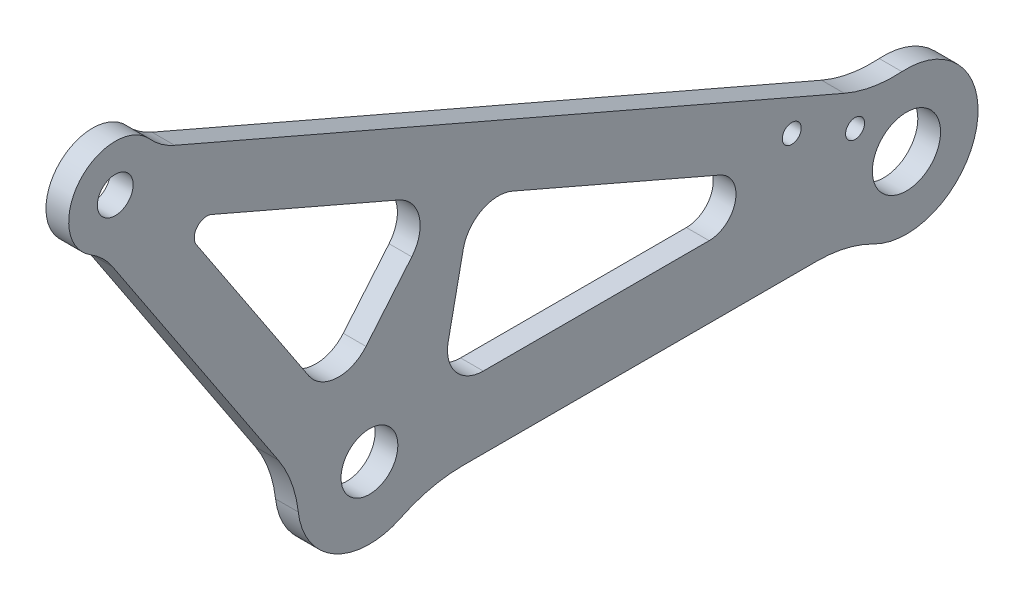
ISO-10303-21;
HEADER;
FILE_DESCRIPTION(('STEP AP214'),'2;1');
FILE_NAME('part.step','',(''),(''),'','','');
FILE_SCHEMA(('AUTOMOTIVE_DESIGN { 1 0 10303 214 1 1 1 1 }'));
ENDSEC;
DATA;
#1=APPLICATION_CONTEXT('core data for automotive mechanical design processes');
#2=APPLICATION_PROTOCOL_DEFINITION('international standard','automotive_design',2000,#1);
#3=PRODUCT_CONTEXT('',#1,'mechanical');
#4=PRODUCT('Part','Part','',(#3));
#5=PRODUCT_RELATED_PRODUCT_CATEGORY('part','',(#4));
#6=PRODUCT_DEFINITION_FORMATION('','',#4);
#7=PRODUCT_DEFINITION_CONTEXT('part definition',#1,'design');
#8=PRODUCT_DEFINITION('design','',#6,#7);
#9=PRODUCT_DEFINITION_SHAPE('','',#8);
#10=(LENGTH_UNIT() NAMED_UNIT(*) SI_UNIT(.MILLI.,.METRE.));
#11=(NAMED_UNIT(*) PLANE_ANGLE_UNIT() SI_UNIT($,.RADIAN.));
#12=(NAMED_UNIT(*) SI_UNIT($,.STERADIAN.) SOLID_ANGLE_UNIT());
#13=UNCERTAINTY_MEASURE_WITH_UNIT(LENGTH_MEASURE(1.E-05),#10,'distance_accuracy_value','');
#14=(GEOMETRIC_REPRESENTATION_CONTEXT(3) GLOBAL_UNCERTAINTY_ASSIGNED_CONTEXT((#13)) GLOBAL_UNIT_ASSIGNED_CONTEXT((#10,
#11,#12)) REPRESENTATION_CONTEXT('',''));
#15=CARTESIAN_POINT('',(0.,0.,0.));
#16=DIRECTION('',(0.,0.,1.));
#17=DIRECTION('',(1.,0.,0.));
#18=AXIS2_PLACEMENT_3D('',#15,#16,#17);
#19=CARTESIAN_POINT('',(6.35,14.,75.));
#20=DIRECTION('',(-1.,0.,0.));
#21=DIRECTION('',(0.,0.,1.));
#22=AXIS2_PLACEMENT_3D('',#19,#20,#21);
#23=CYLINDRICAL_SURFACE('',#22,20.);
#24=CARTESIAN_POINT('',(0.,14.,75.));
#25=DIRECTION('',(1.,0.,0.));
#26=DIRECTION('',(0.,0.,-1.));
#27=AXIS2_PLACEMENT_3D('',#24,#25,#26);
#28=CIRCLE('',#27,20.);
#29=CARTESIAN_POINT('',(0.,11.7382225914099,94.8716975357917));
#30=VERTEX_POINT('',#29);
#31=CARTESIAN_POINT('',(0.,-3.99999999999999,66.2822021129186));
#32=VERTEX_POINT('',#31);
#33=EDGE_CURVE('E376',#30,#32,#28,.T.);
#34=ORIENTED_EDGE('',*,*,#33,.T.);
#35=DIRECTION('',(-1.,0.,0.));
#36=VECTOR('',#35,1.);
#37=CARTESIAN_POINT('',(6.35,-3.99999999999999,66.2822021129186));
#38=LINE('',#37,#36);
#39=CARTESIAN_POINT('',(6.35,-3.99999999999999,66.2822021129186));
#40=VERTEX_POINT('',#39);
#41=EDGE_CURVE('E75',#32,#40,#38,.F.);
#42=ORIENTED_EDGE('',*,*,#41,.T.);
#43=CARTESIAN_POINT('',(6.35,14.,75.));
#44=DIRECTION('',(1.,0.,0.));
#45=DIRECTION('',(0.,0.,-1.));
#46=AXIS2_PLACEMENT_3D('',#43,#44,#45);
#47=CIRCLE('',#46,20.);
#48=CARTESIAN_POINT('',(6.35,11.7382225914099,94.8716975357917));
#49=VERTEX_POINT('',#48);
#50=EDGE_CURVE('E377',#49,#40,#47,.T.);
#51=ORIENTED_EDGE('',*,*,#50,.F.);
#52=DIRECTION('',(-1.,0.,0.));
#53=VECTOR('',#52,1.);
#54=CARTESIAN_POINT('',(6.35,11.7382225914099,94.8716975357917));
#55=LINE('',#54,#53);
#56=EDGE_CURVE('E399',#49,#30,#55,.T.);
#57=ORIENTED_EDGE('',*,*,#56,.T.);
#58=EDGE_LOOP('',(#34,#42,#51,#57));
#59=FACE_BOUND('',#58,.T.);
#60=ADVANCED_FACE('F51',(#59),#23,.T.);
#61=CARTESIAN_POINT('',(6.35,0.,60.7171431429143));
#62=DIRECTION('',(0.,1.,0.));
#63=DIRECTION('',(0.,0.,1.));
#64=AXIS2_PLACEMENT_3D('',#61,#62,#63);
#65=PLANE('',#64);
#66=DIRECTION('',(0.,0.,-1.));
#67=VECTOR('',#66,1.);
#68=CARTESIAN_POINT('',(6.35,0.,60.7171431429143));
#69=LINE('',#68,#67);
#70=CARTESIAN_POINT('',(6.35,0.,48.8466063387559));
#71=VERTEX_POINT('',#70);
#72=CARTESIAN_POINT('',(6.35,0.,-50.0200080064063));
#73=VERTEX_POINT('',#72);
#74=EDGE_CURVE('E380',#71,#73,#69,.T.);
#75=ORIENTED_EDGE('',*,*,#74,.F.);
#76=DIRECTION('',(1.,0.,0.));
#77=VECTOR('',#76,1.);
#78=CARTESIAN_POINT('',(0.,0.,48.8466063387559));
#79=LINE('',#78,#77);
#80=CARTESIAN_POINT('',(0.,0.,48.8466063387559));
#81=VERTEX_POINT('',#80);
#82=EDGE_CURVE('E487',#71,#81,#79,.F.);
#83=ORIENTED_EDGE('',*,*,#82,.T.);
#84=DIRECTION('',(0.,0.,-1.));
#85=VECTOR('',#84,1.);
#86=CARTESIAN_POINT('',(0.,0.,60.7171431429143));
#87=LINE('',#86,#85);
#88=CARTESIAN_POINT('',(0.,0.,-50.0200080064063));
#89=VERTEX_POINT('',#88);
#90=EDGE_CURVE('E402',#81,#89,#87,.T.);
#91=ORIENTED_EDGE('',*,*,#90,.T.);
#92=DIRECTION('',(1.,0.,0.));
#93=VECTOR('',#92,1.);
#94=CARTESIAN_POINT('',(6.35,0.,-50.0200080064063));
#95=LINE('',#94,#93);
#96=EDGE_CURVE('E444',#89,#73,#95,.T.);
#97=ORIENTED_EDGE('',*,*,#96,.T.);
#98=EDGE_LOOP('',(#75,#83,#91,#97));
#99=FACE_BOUND('',#98,.T.);
#100=ADVANCED_FACE('F539',(#99),#65,.F.);
#101=CARTESIAN_POINT('',(6.35,14.,-75.));
#102=DIRECTION('',(-1.,0.,0.));
#103=DIRECTION('',(0.,0.,1.));
#104=AXIS2_PLACEMENT_3D('',#101,#102,#103);
#105=CYLINDRICAL_SURFACE('',#104,20.);
#106=CARTESIAN_POINT('',(0.,14.,-75.));
#107=DIRECTION('',(1.,0.,0.));
#108=DIRECTION('',(0.,0.,-1.));
#109=AXIS2_PLACEMENT_3D('',#106,#107,#108);
#110=CIRCLE('',#109,20.);
#111=CARTESIAN_POINT('',(0.,-3.81818181818182,-65.9163665477841));
#112=VERTEX_POINT('',#111);
#113=CARTESIAN_POINT('',(0.,33.9602946671476,-73.7403822799596));
#114=VERTEX_POINT('',#113);
#115=EDGE_CURVE('E405',#112,#114,#110,.T.);
#116=ORIENTED_EDGE('',*,*,#115,.T.);
#117=DIRECTION('',(-1.,0.,0.));
#118=VECTOR('',#117,1.);
#119=CARTESIAN_POINT('',(6.35,33.9602946671476,-73.7403822799596));
#120=LINE('',#119,#118);
#121=CARTESIAN_POINT('',(6.35,33.9602946671476,-73.7403822799596));
#122=VERTEX_POINT('',#121);
#123=EDGE_CURVE('E441',#114,#122,#120,.F.);
#124=ORIENTED_EDGE('',*,*,#123,.T.);
#125=CARTESIAN_POINT('',(6.35,14.,-75.));
#126=DIRECTION('',(1.,0.,0.));
#127=DIRECTION('',(0.,0.,-1.));
#128=AXIS2_PLACEMENT_3D('',#125,#126,#127);
#129=CIRCLE('',#128,20.);
#130=CARTESIAN_POINT('',(6.35,-3.81818181818182,-65.9163665477841));
#131=VERTEX_POINT('',#130);
#132=EDGE_CURVE('E384',#131,#122,#129,.T.);
#133=ORIENTED_EDGE('',*,*,#132,.F.);
#134=DIRECTION('',(-1.,0.,0.));
#135=VECTOR('',#134,1.);
#136=CARTESIAN_POINT('',(6.35,-3.81818181818182,-65.9163665477841));
#137=LINE('',#136,#135);
#138=EDGE_CURVE('E437',#131,#112,#137,.T.);
#139=ORIENTED_EDGE('',*,*,#138,.T.);
#140=EDGE_LOOP('',(#116,#124,#133,#139));
#141=FACE_BOUND('',#140,.T.);
#142=ADVANCED_FACE('F545',(#141),#105,.T.);
#143=CARTESIAN_POINT('',(6.35,119.878311848488,134.404938559373));
#144=DIRECTION('',(0.,-0.917745162956209,0.39716975699376));
#145=DIRECTION('',(0.,-0.39716975699376,-0.917745162956209));
#146=AXIS2_PLACEMENT_3D('',#143,#144,#145);
#147=PLANE('',#146);
#148=DIRECTION('',(0.,0.39716975699376,0.917745162956209));
#149=VECTOR('',#148,1.);
#150=CARTESIAN_POINT('',(0.,119.878311848488,134.404938559373));
#151=LINE('',#150,#149);
#152=CARTESIAN_POINT('',(0.,36.7697296311885,-57.6351097751074));
#153=VERTEX_POINT('',#152);
#154=CARTESIAN_POINT('',(0.,117.717270204049,129.411392396283));
#155=VERTEX_POINT('',#154);
#156=EDGE_CURVE('E409',#153,#155,#151,.T.);
#157=ORIENTED_EDGE('',*,*,#156,.T.);
#158=DIRECTION('',(1.,0.,0.));
#159=VECTOR('',#158,1.);
#160=CARTESIAN_POINT('',(6.35,117.717270204049,129.411392396283));
#161=LINE('',#160,#159);
#162=CARTESIAN_POINT('',(6.35,117.717270204049,129.411392396283));
#163=VERTEX_POINT('',#162);
#164=EDGE_CURVE('E472',#155,#163,#161,.T.);
#165=ORIENTED_EDGE('',*,*,#164,.T.);
#166=DIRECTION('',(0.,0.39716975699376,0.917745162956209));
#167=VECTOR('',#166,1.);
#168=CARTESIAN_POINT('',(6.35,119.878311848488,134.404938559373));
#169=LINE('',#168,#167);
#170=CARTESIAN_POINT('',(6.35,36.7697296311885,-57.6351097751074));
#171=VERTEX_POINT('',#170);
#172=EDGE_CURVE('E388',#171,#163,#169,.T.);
#173=ORIENTED_EDGE('',*,*,#172,.F.);
#174=DIRECTION('',(1.,0.,0.));
#175=VECTOR('',#174,1.);
#176=CARTESIAN_POINT('',(0.,36.7697296311885,-57.6351097751074));
#177=LINE('',#176,#175);
#178=EDGE_CURVE('E433',#171,#153,#177,.F.);
#179=ORIENTED_EDGE('',*,*,#178,.T.);
#180=EDGE_LOOP('',(#157,#165,#173,#179));
#181=FACE_BOUND('',#180,.T.);
#182=ADVANCED_FACE('F594',(#181),#147,.F.);
#183=CARTESIAN_POINT('',(6.35,114.,146.));
#184=DIRECTION('',(-1.,0.,0.));
#185=DIRECTION('',(0.,0.,1.));
#186=AXIS2_PLACEMENT_3D('',#183,#184,#185);
#187=CYLINDRICAL_SURFACE('',#186,13.);
#188=CARTESIAN_POINT('',(0.,114.,146.));
#189=DIRECTION('',(1.,0.,0.));
#190=DIRECTION('',(0.,0.,-1.));
#191=AXIS2_PLACEMENT_3D('',#188,#189,#190);
#192=CIRCLE('',#191,13.);
#193=CARTESIAN_POINT('',(0.,122.695098637007,136.33587770707));
#194=VERTEX_POINT('',#193);
#195=CARTESIAN_POINT('',(0.,102.960290459899,152.864751508263));
#196=VERTEX_POINT('',#195);
#197=EDGE_CURVE('E413',#194,#196,#192,.T.);
#198=ORIENTED_EDGE('',*,*,#197,.T.);
#199=DIRECTION('',(-1.,0.,0.));
#200=VECTOR('',#199,1.);
#201=CARTESIAN_POINT('',(6.35,102.960290459899,152.864751508263));
#202=LINE('',#201,#200);
#203=CARTESIAN_POINT('',(6.35,102.960290459899,152.864751508263));
#204=VERTEX_POINT('',#203);
#205=EDGE_CURVE('E469',#196,#204,#202,.F.);
#206=ORIENTED_EDGE('',*,*,#205,.T.);
#207=CARTESIAN_POINT('',(6.35,114.,146.));
#208=DIRECTION('',(1.,0.,0.));
#209=DIRECTION('',(0.,0.,-1.));
#210=AXIS2_PLACEMENT_3D('',#207,#208,#209);
#211=CIRCLE('',#210,13.);
#212=CARTESIAN_POINT('',(6.35,122.695098637007,136.33587770707));
#213=VERTEX_POINT('',#212);
#214=EDGE_CURVE('E392',#213,#204,#211,.T.);
#215=ORIENTED_EDGE('',*,*,#214,.F.);
#216=DIRECTION('',(-1.,0.,0.));
#217=VECTOR('',#216,1.);
#218=CARTESIAN_POINT('',(6.35,122.695098637007,136.33587770707));
#219=LINE('',#218,#217);
#220=EDGE_CURVE('E465',#213,#194,#219,.T.);
#221=ORIENTED_EDGE('',*,*,#220,.T.);
#222=EDGE_LOOP('',(#198,#206,#215,#221));
#223=FACE_BOUND('',#222,.T.);
#224=ADVANCED_FACE('F580',(#223),#187,.T.);
#225=CARTESIAN_POINT('',(6.35,101.553480850632,149.752887030597));
#226=DIRECTION('',(0.,0.552019943967369,-0.833830906996294));
#227=DIRECTION('',(0.,0.833830906996294,0.552019943967369));
#228=AXIS2_PLACEMENT_3D('',#225,#226,#227);
#229=PLANE('',#228);
#230=DIRECTION('',(0.,-0.833830906996294,-0.552019943967369));
#231=VECTOR('',#230,1.);
#232=CARTESIAN_POINT('',(6.35,101.553480850632,149.752887030597));
#233=LINE('',#232,#231);
#234=CARTESIAN_POINT('',(6.35,97.0165208160136,146.749289534896));
#235=VERTEX_POINT('',#234);
#236=CARTESIAN_POINT('',(6.35,27.1008101652352,100.463086478557));
#237=VERTEX_POINT('',#236);
#238=EDGE_CURVE('E396',#235,#237,#233,.T.);
#239=ORIENTED_EDGE('',*,*,#238,.F.);
#240=DIRECTION('',(1.,0.,0.));
#241=VECTOR('',#240,1.);
#242=CARTESIAN_POINT('',(0.,97.0165208160136,146.749289534896));
#243=LINE('',#242,#241);
#244=CARTESIAN_POINT('',(0.,97.0165208160136,146.749289534896));
#245=VERTEX_POINT('',#244);
#246=EDGE_CURVE('E461',#235,#245,#243,.F.);
#247=ORIENTED_EDGE('',*,*,#246,.T.);
#248=DIRECTION('',(0.,-0.833830906996294,-0.552019943967369));
#249=VECTOR('',#248,1.);
#250=CARTESIAN_POINT('',(0.,101.553480850632,149.752887030597));
#251=LINE('',#250,#249);
#252=CARTESIAN_POINT('',(0.,27.1008101652352,100.463086478557));
#253=VERTEX_POINT('',#252);
#254=EDGE_CURVE('E381',#245,#253,#251,.T.);
#255=ORIENTED_EDGE('',*,*,#254,.T.);
#256=DIRECTION('',(1.,0.,0.));
#257=VECTOR('',#256,1.);
#258=CARTESIAN_POINT('',(6.35,27.1008101652352,100.463086478557));
#259=LINE('',#258,#257);
#260=EDGE_CURVE('E422',#253,#237,#259,.T.);
#261=ORIENTED_EDGE('',*,*,#260,.T.);
#262=EDGE_LOOP('',(#239,#247,#255,#261));
#263=FACE_BOUND('',#262,.T.);
#264=ADVANCED_FACE('F586',(#263),#229,.F.);
#265=CARTESIAN_POINT('',(6.35,14.,75.));
#266=DIRECTION('',(1.,0.,0.));
#267=DIRECTION('',(0.,0.,-1.));
#268=AXIS2_PLACEMENT_3D('',#265,#266,#267);
#269=PLANE('',#268);
#270=CARTESIAN_POINT('',(6.35,34.4007902462945,-42.9665272972412));
#271=DIRECTION('',(1.,0.,0.));
#272=DIRECTION('',(0.,0.,-1.));
#273=AXIS2_PLACEMENT_3D('',#270,#271,#272);
#274=CIRCLE('',#273,2.65);
#275=CARTESIAN_POINT('',(6.35,34.4007902462945,-45.6165272972412));
#276=VERTEX_POINT('',#275);
#277=EDGE_CURVE('E503',#276,#276,#274,.T.);
#278=ORIENTED_EDGE('',*,*,#277,.F.);
#279=EDGE_LOOP('',(#278));
#280=FACE_BOUND('',#279,.T.);
#281=CARTESIAN_POINT('',(6.35,26.7502274746188,-60.6447791126444));
#282=DIRECTION('',(1.,0.,0.));
#283=DIRECTION('',(0.,0.,-1.));
#284=AXIS2_PLACEMENT_3D('',#281,#282,#283);
#285=CIRCLE('',#284,2.65000000000001);
#286=CARTESIAN_POINT('',(6.35,26.7502274746188,-63.2947791126444));
#287=VERTEX_POINT('',#286);
#288=EDGE_CURVE('E495',#287,#287,#285,.T.);
#289=ORIENTED_EDGE('',*,*,#288,.F.);
#290=EDGE_LOOP('',(#289));
#291=FACE_BOUND('',#290,.T.);
#292=CARTESIAN_POINT('',(6.35,30.,43.1954781826125));
#293=DIRECTION('',(1.,0.,0.));
#294=DIRECTION('',(0.,0.,-1.));
#295=AXIS2_PLACEMENT_3D('',#292,#293,#294);
#296=CIRCLE('',#295,10.);
#297=CARTESIAN_POINT('',(6.35,32.0279896085014,52.9876821300296));
#298=VERTEX_POINT('',#297);
#299=CARTESIAN_POINT('',(6.35,20.,43.1954781826125));
#300=VERTEX_POINT('',#299);
#301=EDGE_CURVE('E222',#298,#300,#296,.T.);
#302=ORIENTED_EDGE('',*,*,#301,.F.);
#303=DIRECTION('',(0.,-0.979220394741707,0.202798960850138));
#304=VECTOR('',#303,1.);
#305=CARTESIAN_POINT('',(6.35,32.0279896085014,52.9876821300296));
#306=LINE('',#305,#304);
#307=CARTESIAN_POINT('',(6.35,52.2877363487515,48.7918385711406));
#308=VERTEX_POINT('',#307);
#309=EDGE_CURVE('E228',#308,#298,#306,.T.);
#310=ORIENTED_EDGE('',*,*,#309,.F.);
#311=CARTESIAN_POINT('',(6.35,50.2597467402501,38.9996346237235));
#312=DIRECTION('',(1.,0.,0.));
#313=DIRECTION('',(0.,0.,1.));
#314=AXIS2_PLACEMENT_3D('',#311,#312,#313);
#315=CIRCLE('',#314,10.);
#316=CARTESIAN_POINT('',(6.35,59.4371983698122,35.0279370537859));
#317=VERTEX_POINT('',#316);
#318=EDGE_CURVE('E266',#317,#308,#315,.T.);
#319=ORIENTED_EDGE('',*,*,#318,.F.);
#320=DIRECTION('',(0.,0.39716975699376,0.917745162956209));
#321=VECTOR('',#320,1.);
#322=CARTESIAN_POINT('',(6.35,59.4371983698122,35.0279370537859));
#323=LINE('',#322,#321);
#324=CARTESIAN_POINT('',(6.35,34.3830887221716,-22.8649098621939));
#325=VERTEX_POINT('',#324);
#326=EDGE_CURVE('E262',#325,#317,#323,.T.);
#327=ORIENTED_EDGE('',*,*,#326,.F.);
#328=CARTESIAN_POINT('',(6.35,27.5000000000001,-19.8861366847402));
#329=DIRECTION('',(1.,0.,0.));
#330=DIRECTION('',(0.,0.,-1.));
#331=AXIS2_PLACEMENT_3D('',#328,#329,#330);
#332=CIRCLE('',#331,7.50000000000012);
#333=CARTESIAN_POINT('',(6.35,20.,-19.8861366847407));
#334=VERTEX_POINT('',#333);
#335=EDGE_CURVE('E258',#334,#325,#332,.T.);
#336=ORIENTED_EDGE('',*,*,#335,.F.);
#337=DIRECTION('',(0.,0.,-1.));
#338=VECTOR('',#337,1.);
#339=CARTESIAN_POINT('',(6.35,20.,-19.8861366847407));
#340=LINE('',#339,#338);
#341=EDGE_CURVE('E250',#300,#334,#340,.T.);
#342=ORIENTED_EDGE('',*,*,#341,.F.);
#343=EDGE_LOOP('',(#302,#310,#319,#327,#336,#342));
#344=FACE_BOUND('',#343,.T.);
#345=CARTESIAN_POINT('',(6.35,92.581437501733,120.427100877121));
#346=DIRECTION('',(1.,0.,0.));
#347=DIRECTION('',(0.,0.,-1.));
#348=AXIS2_PLACEMENT_3D('',#345,#346,#347);
#349=CIRCLE('',#348,3.49999999999999);
#350=CARTESIAN_POINT('',(6.35,95.7935455720797,119.037006727643));
#351=VERTEX_POINT('',#350);
#352=CARTESIAN_POINT('',(6.35,90.6493676978472,123.345509051608));
#353=VERTEX_POINT('',#352);
#354=EDGE_CURVE('E330',#351,#353,#349,.T.);
#355=ORIENTED_EDGE('',*,*,#354,.F.);
#356=DIRECTION('',(0.,0.397169756993759,0.917745162956209));
#357=VECTOR('',#356,1.);
#358=CARTESIAN_POINT('',(6.35,95.7935455720797,119.037006727643));
#359=LINE('',#358,#357);
#360=CARTESIAN_POINT('',(6.35,73.2135031032277,66.8610180219863));
#361=VERTEX_POINT('',#360);
#362=EDGE_CURVE('E296',#361,#351,#359,.T.);
#363=ORIENTED_EDGE('',*,*,#362,.F.);
#364=CARTESIAN_POINT('',(6.35,64.0360514736656,70.8327155919239));
#365=DIRECTION('',(1.,0.,0.));
#366=DIRECTION('',(0.,0.,-1.));
#367=AXIS2_PLACEMENT_3D('',#364,#365,#366);
#368=CIRCLE('',#367,10.);
#369=CARTESIAN_POINT('',(6.35,57.6151528400077,63.1664217848558));
#370=VERTEX_POINT('',#369);
#371=EDGE_CURVE('E314',#370,#361,#368,.T.);
#372=ORIENTED_EDGE('',*,*,#371,.F.);
#373=DIRECTION('',(0.,0.766629380706807,-0.642089863365789));
#374=VECTOR('',#373,1.);
#375=CARTESIAN_POINT('',(6.35,42.3434042301445,75.9572633897303));
#376=LINE('',#375,#374);
#377=CARTESIAN_POINT('',(6.35,42.3434042301445,75.9572633897303));
#378=VERTEX_POINT('',#377);
#379=EDGE_CURVE('E318',#378,#370,#376,.T.);
#380=ORIENTED_EDGE('',*,*,#379,.F.);
#381=CARTESIAN_POINT('',(6.35,48.7643028638024,83.6235571967984));
#382=DIRECTION('',(1.,0.,0.));
#383=DIRECTION('',(0.,0.,1.));
#384=AXIS2_PLACEMENT_3D('',#381,#382,#383);
#385=CIRCLE('',#384,10.);
#386=CARTESIAN_POINT('',(6.35,43.2441034241287,91.9618662667613));
#387=VERTEX_POINT('',#386);
#388=EDGE_CURVE('E322',#387,#378,#385,.T.);
#389=ORIENTED_EDGE('',*,*,#388,.F.);
#390=DIRECTION('',(0.,-0.833830906996294,-0.552019943967369));
#391=VECTOR('',#390,1.);
#392=CARTESIAN_POINT('',(6.35,90.6493676978472,123.345509051608));
#393=LINE('',#392,#391);
#394=EDGE_CURVE('E326',#353,#387,#393,.T.);
#395=ORIENTED_EDGE('',*,*,#394,.F.);
#396=EDGE_LOOP('',(#355,#363,#372,#380,#389,#395));
#397=FACE_BOUND('',#396,.T.);
#398=CARTESIAN_POINT('',(6.35,14.,75.));
#399=DIRECTION('',(1.,0.,0.));
#400=DIRECTION('',(0.,0.,-1.));
#401=AXIS2_PLACEMENT_3D('',#398,#399,#400);
#402=CIRCLE('',#401,7.9375);
#403=CARTESIAN_POINT('',(6.35,14.,67.0625));
#404=VERTEX_POINT('',#403);
#405=EDGE_CURVE('E237',#404,#404,#402,.T.);
#406=ORIENTED_EDGE('',*,*,#405,.F.);
#407=EDGE_LOOP('',(#406));
#408=FACE_BOUND('',#407,.T.);
#409=CARTESIAN_POINT('',(6.35,114.,146.));
#410=DIRECTION('',(1.,0.,0.));
#411=DIRECTION('',(0.,0.,-1.));
#412=AXIS2_PLACEMENT_3D('',#409,#410,#411);
#413=CIRCLE('',#412,5.);
#414=CARTESIAN_POINT('',(6.35,114.,141.));
#415=VERTEX_POINT('',#414);
#416=EDGE_CURVE('E360',#415,#415,#413,.T.);
#417=ORIENTED_EDGE('',*,*,#416,.F.);
#418=EDGE_LOOP('',(#417));
#419=FACE_BOUND('',#418,.T.);
#420=CARTESIAN_POINT('',(6.35,14.,-75.));
#421=DIRECTION('',(1.,0.,0.));
#422=DIRECTION('',(0.,0.,-1.));
#423=AXIS2_PLACEMENT_3D('',#420,#421,#422);
#424=CIRCLE('',#423,9.52499999999999);
#425=CARTESIAN_POINT('',(6.35,14.,-84.525));
#426=VERTEX_POINT('',#425);
#427=EDGE_CURVE('E368',#426,#426,#424,.T.);
#428=ORIENTED_EDGE('',*,*,#427,.F.);
#429=EDGE_LOOP('',(#428));
#430=FACE_BOUND('',#429,.T.);
#431=ORIENTED_EDGE('',*,*,#214,.T.);
#432=CARTESIAN_POINT('',(6.35,85.9761219366663,163.425907674821));
#433=DIRECTION('',(1.,0.,0.));
#434=DIRECTION('',(0.,0.,-1.));
#435=AXIS2_PLACEMENT_3D('',#432,#433,#434);
#436=CIRCLE('',#435,20.);
#437=EDGE_CURVE('E478',#204,#235,#436,.F.);
#438=ORIENTED_EDGE('',*,*,#437,.T.);
#439=ORIENTED_EDGE('',*,*,#238,.T.);
#440=CARTESIAN_POINT('',(6.35,7.78011212637733,129.647168223427));
#441=DIRECTION('',(1.,0.,0.));
#442=DIRECTION('',(0.,0.,-1.));
#443=AXIS2_PLACEMENT_3D('',#440,#441,#442);
#444=CIRCLE('',#443,35.);
#445=EDGE_CURVE('E430',#237,#49,#444,.F.);
#446=ORIENTED_EDGE('',*,*,#445,.T.);
#447=ORIENTED_EDGE('',*,*,#50,.T.);
#448=CARTESIAN_POINT('',(6.35,-40.,48.8466063387559));
#449=DIRECTION('',(1.,0.,0.));
#450=DIRECTION('',(0.,0.,-1.));
#451=AXIS2_PLACEMENT_3D('',#448,#449,#450);
#452=CIRCLE('',#451,40.);
#453=EDGE_CURVE('E11',#40,#71,#452,.F.);
#454=ORIENTED_EDGE('',*,*,#453,.T.);
#455=ORIENTED_EDGE('',*,*,#74,.T.);
#456=CARTESIAN_POINT('',(6.35,-35.,-50.0200080064063));
#457=DIRECTION('',(1.,0.,0.));
#458=DIRECTION('',(0.,0.,-1.));
#459=AXIS2_PLACEMENT_3D('',#456,#457,#458);
#460=CIRCLE('',#459,35.);
#461=EDGE_CURVE('E458',#73,#131,#460,.F.);
#462=ORIENTED_EDGE('',*,*,#461,.T.);
#463=ORIENTED_EDGE('',*,*,#132,.T.);
#464=CARTESIAN_POINT('',(6.35,68.8908103346559,-71.5360512698889));
#465=DIRECTION('',(1.,0.,0.));
#466=DIRECTION('',(0.,0.,-1.));
#467=AXIS2_PLACEMENT_3D('',#464,#465,#466);
#468=CIRCLE('',#467,35.);
#469=EDGE_CURVE('E451',#122,#171,#468,.F.);
#470=ORIENTED_EDGE('',*,*,#469,.T.);
#471=ORIENTED_EDGE('',*,*,#172,.T.);
#472=CARTESIAN_POINT('',(6.35,136.072173463173,121.467997256408));
#473=DIRECTION('',(1.,0.,0.));
#474=DIRECTION('',(0.,0.,-1.));
#475=AXIS2_PLACEMENT_3D('',#472,#473,#474);
#476=CIRCLE('',#475,20.);
#477=EDGE_CURVE('E484',#163,#213,#476,.F.);
#478=ORIENTED_EDGE('',*,*,#477,.T.);
#479=EDGE_LOOP('',(#431,#438,#439,#446,#447,#454,#455,#462,#463,#470,#471,#478));
#480=FACE_BOUND('',#479,.T.);
#481=ADVANCED_FACE('F524',(#280,#291,#344,#397,#408,#419,#430,#480),#269,.T.);
#482=CARTESIAN_POINT('',(0.,14.,75.));
#483=DIRECTION('',(1.,0.,0.));
#484=DIRECTION('',(0.,0.,-1.));
#485=AXIS2_PLACEMENT_3D('',#482,#483,#484);
#486=PLANE('',#485);
#487=CARTESIAN_POINT('',(0.,34.4007902462945,-42.9665272972412));
#488=DIRECTION('',(1.,0.,0.));
#489=DIRECTION('',(0.,0.,-1.));
#490=AXIS2_PLACEMENT_3D('',#487,#488,#489);
#491=CIRCLE('',#490,2.65);
#492=CARTESIAN_POINT('',(0.,34.4007902462945,-45.6165272972412));
#493=VERTEX_POINT('',#492);
#494=EDGE_CURVE('E55',#493,#493,#491,.T.);
#495=ORIENTED_EDGE('',*,*,#494,.T.);
#496=EDGE_LOOP('',(#495));
#497=FACE_BOUND('',#496,.T.);
#498=CARTESIAN_POINT('',(0.,26.7502274746188,-60.6447791126444));
#499=DIRECTION('',(1.,0.,0.));
#500=DIRECTION('',(0.,0.,-1.));
#501=AXIS2_PLACEMENT_3D('',#498,#499,#500);
#502=CIRCLE('',#501,2.65000000000001);
#503=CARTESIAN_POINT('',(0.,26.7502274746188,-63.2947791126444));
#504=VERTEX_POINT('',#503);
#505=EDGE_CURVE('E291',#504,#504,#502,.T.);
#506=ORIENTED_EDGE('',*,*,#505,.T.);
#507=EDGE_LOOP('',(#506));
#508=FACE_BOUND('',#507,.T.);
#509=DIRECTION('',(0.,0.979220394741707,-0.202798960850138));
#510=VECTOR('',#509,1.);
#511=CARTESIAN_POINT('',(0.,32.0279896085014,52.9876821300296));
#512=LINE('',#511,#510);
#513=CARTESIAN_POINT('',(0.,32.0279896085014,52.9876821300296));
#514=VERTEX_POINT('',#513);
#515=CARTESIAN_POINT('',(0.,52.2877363487515,48.7918385711406));
#516=VERTEX_POINT('',#515);
#517=EDGE_CURVE('E244',#514,#516,#512,.T.);
#518=ORIENTED_EDGE('',*,*,#517,.F.);
#519=CARTESIAN_POINT('',(0.,30.,43.1954781826125));
#520=DIRECTION('',(1.,0.,0.));
#521=DIRECTION('',(0.,0.,-1.));
#522=AXIS2_PLACEMENT_3D('',#519,#520,#521);
#523=CIRCLE('',#522,10.);
#524=CARTESIAN_POINT('',(0.,20.,43.1954781826125));
#525=VERTEX_POINT('',#524);
#526=EDGE_CURVE('E219',#525,#514,#523,.F.);
#527=ORIENTED_EDGE('',*,*,#526,.F.);
#528=DIRECTION('',(0.,0.,1.));
#529=VECTOR('',#528,1.);
#530=CARTESIAN_POINT('',(0.,20.,-19.8861366847407));
#531=LINE('',#530,#529);
#532=CARTESIAN_POINT('',(0.,20.,-19.8861366847407));
#533=VERTEX_POINT('',#532);
#534=EDGE_CURVE('E232',#533,#525,#531,.T.);
#535=ORIENTED_EDGE('',*,*,#534,.F.);
#536=CARTESIAN_POINT('',(0.,27.5000000000001,-19.8861366847402));
#537=DIRECTION('',(1.,0.,0.));
#538=DIRECTION('',(0.,0.,-1.));
#539=AXIS2_PLACEMENT_3D('',#536,#537,#538);
#540=CIRCLE('',#539,7.50000000000012);
#541=CARTESIAN_POINT('',(0.,34.3830887221716,-22.8649098621939));
#542=VERTEX_POINT('',#541);
#543=EDGE_CURVE('E352',#542,#533,#540,.F.);
#544=ORIENTED_EDGE('',*,*,#543,.F.);
#545=DIRECTION('',(0.,-0.39716975699376,-0.917745162956209));
#546=VECTOR('',#545,1.);
#547=CARTESIAN_POINT('',(0.,59.4371983698122,35.0279370537859));
#548=LINE('',#547,#546);
#549=CARTESIAN_POINT('',(0.,59.4371983698122,35.0279370537859));
#550=VERTEX_POINT('',#549);
#551=EDGE_CURVE('E508',#550,#542,#548,.T.);
#552=ORIENTED_EDGE('',*,*,#551,.F.);
#553=CARTESIAN_POINT('',(0.,50.2597467402501,38.9996346237235));
#554=DIRECTION('',(1.,0.,0.));
#555=DIRECTION('',(0.,0.,-1.));
#556=AXIS2_PLACEMENT_3D('',#553,#554,#555);
#557=CIRCLE('',#556,10.);
#558=EDGE_CURVE('E252',#516,#550,#557,.F.);
#559=ORIENTED_EDGE('',*,*,#558,.F.);
#560=EDGE_LOOP('',(#518,#527,#535,#544,#552,#559));
#561=FACE_BOUND('',#560,.T.);
#562=DIRECTION('',(0.,-0.397169756993759,-0.917745162956209));
#563=VECTOR('',#562,1.);
#564=CARTESIAN_POINT('',(0.,95.7935455720797,119.037006727643));
#565=LINE('',#564,#563);
#566=CARTESIAN_POINT('',(0.,95.7935455720797,119.037006727643));
#567=VERTEX_POINT('',#566);
#568=CARTESIAN_POINT('',(0.,73.2135031032277,66.8610180219863));
#569=VERTEX_POINT('',#568);
#570=EDGE_CURVE('E337',#567,#569,#565,.T.);
#571=ORIENTED_EDGE('',*,*,#570,.F.);
#572=CARTESIAN_POINT('',(0.,92.581437501733,120.427100877121));
#573=DIRECTION('',(1.,0.,0.));
#574=DIRECTION('',(0.,0.,-1.));
#575=AXIS2_PLACEMENT_3D('',#572,#573,#574);
#576=CIRCLE('',#575,3.49999999999999);
#577=CARTESIAN_POINT('',(0.,90.6493676978472,123.345509051608));
#578=VERTEX_POINT('',#577);
#579=EDGE_CURVE('E333',#578,#567,#576,.F.);
#580=ORIENTED_EDGE('',*,*,#579,.F.);
#581=DIRECTION('',(0.,0.833830906996294,0.552019943967369));
#582=VECTOR('',#581,1.);
#583=CARTESIAN_POINT('',(0.,90.6493676978472,123.345509051608));
#584=LINE('',#583,#582);
#585=CARTESIAN_POINT('',(0.,43.2441034241287,91.9618662667613));
#586=VERTEX_POINT('',#585);
#587=EDGE_CURVE('E286',#586,#578,#584,.T.);
#588=ORIENTED_EDGE('',*,*,#587,.F.);
#589=CARTESIAN_POINT('',(0.,48.7643028638024,83.6235571967984));
#590=DIRECTION('',(1.,0.,0.));
#591=DIRECTION('',(0.,0.,-1.));
#592=AXIS2_PLACEMENT_3D('',#589,#590,#591);
#593=CIRCLE('',#592,10.);
#594=CARTESIAN_POINT('',(0.,42.3434042301445,75.9572633897303));
#595=VERTEX_POINT('',#594);
#596=EDGE_CURVE('E349',#595,#586,#593,.F.);
#597=ORIENTED_EDGE('',*,*,#596,.F.);
#598=DIRECTION('',(0.,-0.766629380706807,0.642089863365789));
#599=VECTOR('',#598,1.);
#600=CARTESIAN_POINT('',(0.,42.3434042301445,75.9572633897303));
#601=LINE('',#600,#599);
#602=CARTESIAN_POINT('',(0.,57.6151528400077,63.1664217848558));
#603=VERTEX_POINT('',#602);
#604=EDGE_CURVE('E345',#603,#595,#601,.T.);
#605=ORIENTED_EDGE('',*,*,#604,.F.);
#606=CARTESIAN_POINT('',(0.,64.0360514736656,70.8327155919239));
#607=DIRECTION('',(1.,0.,0.));
#608=DIRECTION('',(0.,0.,-1.));
#609=AXIS2_PLACEMENT_3D('',#606,#607,#608);
#610=CIRCLE('',#609,10.);
#611=EDGE_CURVE('E341',#569,#603,#610,.F.);
#612=ORIENTED_EDGE('',*,*,#611,.F.);
#613=EDGE_LOOP('',(#571,#580,#588,#597,#605,#612));
#614=FACE_BOUND('',#613,.T.);
#615=CARTESIAN_POINT('',(0.,14.,75.));
#616=DIRECTION('',(1.,0.,0.));
#617=DIRECTION('',(0.,0.,-1.));
#618=AXIS2_PLACEMENT_3D('',#615,#616,#617);
#619=CIRCLE('',#618,7.9375);
#620=CARTESIAN_POINT('',(0.,14.,67.0625));
#621=VERTEX_POINT('',#620);
#622=EDGE_CURVE('E356',#621,#621,#619,.T.);
#623=ORIENTED_EDGE('',*,*,#622,.T.);
#624=EDGE_LOOP('',(#623));
#625=FACE_BOUND('',#624,.T.);
#626=CARTESIAN_POINT('',(0.,114.,146.));
#627=DIRECTION('',(1.,0.,0.));
#628=DIRECTION('',(0.,0.,-1.));
#629=AXIS2_PLACEMENT_3D('',#626,#627,#628);
#630=CIRCLE('',#629,5.);
#631=CARTESIAN_POINT('',(0.,114.,141.));
#632=VERTEX_POINT('',#631);
#633=EDGE_CURVE('E364',#632,#632,#630,.T.);
#634=ORIENTED_EDGE('',*,*,#633,.T.);
#635=EDGE_LOOP('',(#634));
#636=FACE_BOUND('',#635,.T.);
#637=CARTESIAN_POINT('',(0.,14.,-75.));
#638=DIRECTION('',(1.,0.,0.));
#639=DIRECTION('',(0.,0.,-1.));
#640=AXIS2_PLACEMENT_3D('',#637,#638,#639);
#641=CIRCLE('',#640,9.52499999999999);
#642=CARTESIAN_POINT('',(0.,14.,-84.525));
#643=VERTEX_POINT('',#642);
#644=EDGE_CURVE('E372',#643,#643,#641,.T.);
#645=ORIENTED_EDGE('',*,*,#644,.T.);
#646=EDGE_LOOP('',(#645));
#647=FACE_BOUND('',#646,.T.);
#648=ORIENTED_EDGE('',*,*,#33,.F.);
#649=CARTESIAN_POINT('',(0.,7.78011212637733,129.647168223427));
#650=DIRECTION('',(1.,0.,0.));
#651=DIRECTION('',(0.,0.,-1.));
#652=AXIS2_PLACEMENT_3D('',#649,#650,#651);
#653=CIRCLE('',#652,35.);
#654=EDGE_CURVE('E426',#30,#253,#653,.T.);
#655=ORIENTED_EDGE('',*,*,#654,.T.);
#656=ORIENTED_EDGE('',*,*,#254,.F.);
#657=CARTESIAN_POINT('',(0.,85.9761219366663,163.425907674821));
#658=DIRECTION('',(1.,0.,0.));
#659=DIRECTION('',(0.,0.,-1.));
#660=AXIS2_PLACEMENT_3D('',#657,#658,#659);
#661=CIRCLE('',#660,20.);
#662=EDGE_CURVE('E475',#245,#196,#661,.T.);
#663=ORIENTED_EDGE('',*,*,#662,.T.);
#664=ORIENTED_EDGE('',*,*,#197,.F.);
#665=CARTESIAN_POINT('',(0.,136.072173463173,121.467997256408));
#666=DIRECTION('',(1.,0.,0.));
#667=DIRECTION('',(0.,0.,-1.));
#668=AXIS2_PLACEMENT_3D('',#665,#666,#667);
#669=CIRCLE('',#668,20.);
#670=EDGE_CURVE('E481',#194,#155,#669,.T.);
#671=ORIENTED_EDGE('',*,*,#670,.T.);
#672=ORIENTED_EDGE('',*,*,#156,.F.);
#673=CARTESIAN_POINT('',(0.,68.8908103346559,-71.5360512698889));
#674=DIRECTION('',(1.,0.,0.));
#675=DIRECTION('',(0.,0.,-1.));
#676=AXIS2_PLACEMENT_3D('',#673,#674,#675);
#677=CIRCLE('',#676,35.);
#678=EDGE_CURVE('E448',#153,#114,#677,.T.);
#679=ORIENTED_EDGE('',*,*,#678,.T.);
#680=ORIENTED_EDGE('',*,*,#115,.F.);
#681=CARTESIAN_POINT('',(0.,-35.,-50.0200080064063));
#682=DIRECTION('',(1.,0.,0.));
#683=DIRECTION('',(0.,0.,-1.));
#684=AXIS2_PLACEMENT_3D('',#681,#682,#683);
#685=CIRCLE('',#684,35.);
#686=EDGE_CURVE('E454',#112,#89,#685,.T.);
#687=ORIENTED_EDGE('',*,*,#686,.T.);
#688=ORIENTED_EDGE('',*,*,#90,.F.);
#689=CARTESIAN_POINT('',(0.,-40.,48.8466063387559));
#690=DIRECTION('',(1.,0.,0.));
#691=DIRECTION('',(0.,0.,-1.));
#692=AXIS2_PLACEMENT_3D('',#689,#690,#691);
#693=CIRCLE('',#692,40.);
#694=EDGE_CURVE('E61',#81,#32,#693,.T.);
#695=ORIENTED_EDGE('',*,*,#694,.T.);
#696=EDGE_LOOP('',(#648,#655,#656,#663,#664,#671,#672,#679,#680,#687,#688,#695));
#697=FACE_BOUND('',#696,.T.);
#698=ADVANCED_FACE('F240',(#497,#508,#561,#614,#625,#636,#647,#697),#486,.F.);
#699=CARTESIAN_POINT('',(6.35,14.,-75.));
#700=DIRECTION('',(1.,0.,0.));
#701=DIRECTION('',(0.,0.,-1.));
#702=AXIS2_PLACEMENT_3D('',#699,#700,#701);
#703=CYLINDRICAL_SURFACE('',#702,9.52499999999999);
#704=ORIENTED_EDGE('',*,*,#644,.F.);
#705=EDGE_LOOP('',(#704));
#706=FACE_BOUND('',#705,.T.);
#707=ORIENTED_EDGE('',*,*,#427,.T.);
#708=EDGE_LOOP('',(#707));
#709=FACE_BOUND('',#708,.T.);
#710=ADVANCED_FACE('F618',(#706,#709),#703,.F.);
#711=CARTESIAN_POINT('',(6.35,114.,146.));
#712=DIRECTION('',(1.,0.,0.));
#713=DIRECTION('',(0.,0.,-1.));
#714=AXIS2_PLACEMENT_3D('',#711,#712,#713);
#715=CYLINDRICAL_SURFACE('',#714,5.);
#716=ORIENTED_EDGE('',*,*,#633,.F.);
#717=EDGE_LOOP('',(#716));
#718=FACE_BOUND('',#717,.T.);
#719=ORIENTED_EDGE('',*,*,#416,.T.);
#720=EDGE_LOOP('',(#719));
#721=FACE_BOUND('',#720,.T.);
#722=ADVANCED_FACE('F625',(#718,#721),#715,.F.);
#723=CARTESIAN_POINT('',(6.35,14.,75.));
#724=DIRECTION('',(1.,0.,0.));
#725=DIRECTION('',(0.,0.,-1.));
#726=AXIS2_PLACEMENT_3D('',#723,#724,#725);
#727=CYLINDRICAL_SURFACE('',#726,7.9375);
#728=ORIENTED_EDGE('',*,*,#622,.F.);
#729=EDGE_LOOP('',(#728));
#730=FACE_BOUND('',#729,.T.);
#731=ORIENTED_EDGE('',*,*,#405,.T.);
#732=EDGE_LOOP('',(#731));
#733=FACE_BOUND('',#732,.T.);
#734=ADVANCED_FACE('F629',(#730,#733),#727,.F.);
#735=CARTESIAN_POINT('',(-0.00100000000000013,92.581437501733,120.427100877121));
#736=DIRECTION('',(1.,0.,0.));
#737=DIRECTION('',(0.,0.,-1.));
#738=AXIS2_PLACEMENT_3D('',#735,#736,#737);
#739=CYLINDRICAL_SURFACE('',#738,3.49999999999999);
#740=ORIENTED_EDGE('',*,*,#579,.T.);
#741=DIRECTION('',(1.,0.,0.));
#742=VECTOR('',#741,1.);
#743=CARTESIAN_POINT('',(-0.00100000000000013,95.7935455720797,119.037006727643));
#744=LINE('',#743,#742);
#745=EDGE_CURVE('E290',#567,#351,#744,.T.);
#746=ORIENTED_EDGE('',*,*,#745,.T.);
#747=ORIENTED_EDGE('',*,*,#354,.T.);
#748=DIRECTION('',(1.,0.,0.));
#749=VECTOR('',#748,1.);
#750=CARTESIAN_POINT('',(-0.00100000000000013,90.6493676978472,123.345509051608));
#751=LINE('',#750,#749);
#752=EDGE_CURVE('E292',#578,#353,#751,.T.);
#753=ORIENTED_EDGE('',*,*,#752,.F.);
#754=EDGE_LOOP('',(#740,#746,#747,#753));
#755=FACE_BOUND('',#754,.T.);
#756=ADVANCED_FACE('F633',(#755),#739,.F.);
#757=CARTESIAN_POINT('',(-0.00100000000000013,95.7935455720797,119.037006727643));
#758=DIRECTION('',(0.,0.917745162956209,-0.397169756993759));
#759=DIRECTION('',(0.,0.397169756993759,0.917745162956209));
#760=AXIS2_PLACEMENT_3D('',#757,#758,#759);
#761=PLANE('',#760);
#762=ORIENTED_EDGE('',*,*,#570,.T.);
#763=DIRECTION('',(1.,0.,0.));
#764=VECTOR('',#763,1.);
#765=CARTESIAN_POINT('',(-0.00100000000000013,73.2135031032277,66.8610180219863));
#766=LINE('',#765,#764);
#767=EDGE_CURVE('E306',#569,#361,#766,.T.);
#768=ORIENTED_EDGE('',*,*,#767,.T.);
#769=ORIENTED_EDGE('',*,*,#362,.T.);
#770=ORIENTED_EDGE('',*,*,#745,.F.);
#771=EDGE_LOOP('',(#762,#768,#769,#770));
#772=FACE_BOUND('',#771,.T.);
#773=ADVANCED_FACE('F635',(#772),#761,.F.);
#774=CARTESIAN_POINT('',(-0.00100000000000013,64.0360514736656,70.8327155919239));
#775=DIRECTION('',(1.,0.,0.));
#776=DIRECTION('',(0.,0.,-1.));
#777=AXIS2_PLACEMENT_3D('',#774,#775,#776);
#778=CYLINDRICAL_SURFACE('',#777,10.);
#779=ORIENTED_EDGE('',*,*,#611,.T.);
#780=DIRECTION('',(1.,0.,0.));
#781=VECTOR('',#780,1.);
#782=CARTESIAN_POINT('',(-0.00100000000000013,57.6151528400077,63.1664217848558));
#783=LINE('',#782,#781);
#784=EDGE_CURVE('E303',#603,#370,#783,.T.);
#785=ORIENTED_EDGE('',*,*,#784,.T.);
#786=ORIENTED_EDGE('',*,*,#371,.T.);
#787=ORIENTED_EDGE('',*,*,#767,.F.);
#788=EDGE_LOOP('',(#779,#785,#786,#787));
#789=FACE_BOUND('',#788,.T.);
#790=ADVANCED_FACE('F638',(#789),#778,.F.);
#791=CARTESIAN_POINT('',(-0.00100000000000013,42.3434042301445,75.9572633897303));
#792=DIRECTION('',(0.,-0.642089863365789,-0.766629380706807));
#793=DIRECTION('',(0.,0.766629380706807,-0.642089863365789));
#794=AXIS2_PLACEMENT_3D('',#791,#792,#793);
#795=PLANE('',#794);
#796=ORIENTED_EDGE('',*,*,#604,.T.);
#797=DIRECTION('',(1.,0.,0.));
#798=VECTOR('',#797,1.);
#799=CARTESIAN_POINT('',(-0.00100000000000013,42.3434042301445,75.9572633897303));
#800=LINE('',#799,#798);
#801=EDGE_CURVE('E300',#595,#378,#800,.T.);
#802=ORIENTED_EDGE('',*,*,#801,.T.);
#803=ORIENTED_EDGE('',*,*,#379,.T.);
#804=ORIENTED_EDGE('',*,*,#784,.F.);
#805=EDGE_LOOP('',(#796,#802,#803,#804));
#806=FACE_BOUND('',#805,.T.);
#807=ADVANCED_FACE('F642',(#806),#795,.F.);
#808=CARTESIAN_POINT('',(-0.00100000000000013,48.7643028638024,83.6235571967984));
#809=DIRECTION('',(1.,0.,0.));
#810=DIRECTION('',(0.,0.,-1.));
#811=AXIS2_PLACEMENT_3D('',#808,#809,#810);
#812=CYLINDRICAL_SURFACE('',#811,10.);
#813=ORIENTED_EDGE('',*,*,#596,.T.);
#814=DIRECTION('',(1.,0.,0.));
#815=VECTOR('',#814,1.);
#816=CARTESIAN_POINT('',(-0.00100000000000013,43.2441034241287,91.9618662667613));
#817=LINE('',#816,#815);
#818=EDGE_CURVE('E297',#586,#387,#817,.T.);
#819=ORIENTED_EDGE('',*,*,#818,.T.);
#820=ORIENTED_EDGE('',*,*,#388,.T.);
#821=ORIENTED_EDGE('',*,*,#801,.F.);
#822=EDGE_LOOP('',(#813,#819,#820,#821));
#823=FACE_BOUND('',#822,.T.);
#824=ADVANCED_FACE('F646',(#823),#812,.F.);
#825=CARTESIAN_POINT('',(-0.00100000000000013,90.6493676978472,123.345509051608));
#826=DIRECTION('',(0.,-0.552019943967369,0.833830906996294));
#827=DIRECTION('',(0.,-0.833830906996294,-0.552019943967369));
#828=AXIS2_PLACEMENT_3D('',#825,#826,#827);
#829=PLANE('',#828);
#830=ORIENTED_EDGE('',*,*,#587,.T.);
#831=ORIENTED_EDGE('',*,*,#752,.T.);
#832=ORIENTED_EDGE('',*,*,#394,.T.);
#833=ORIENTED_EDGE('',*,*,#818,.F.);
#834=EDGE_LOOP('',(#830,#831,#832,#833));
#835=FACE_BOUND('',#834,.T.);
#836=ADVANCED_FACE('F535',(#835),#829,.F.);
#837=CARTESIAN_POINT('',(-0.00100000000000013,30.,43.1954781826125));
#838=DIRECTION('',(1.,0.,0.));
#839=DIRECTION('',(0.,0.,-1.));
#840=AXIS2_PLACEMENT_3D('',#837,#838,#839);
#841=CYLINDRICAL_SURFACE('',#840,10.);
#842=ORIENTED_EDGE('',*,*,#526,.T.);
#843=DIRECTION('',(1.,0.,0.));
#844=VECTOR('',#843,1.);
#845=CARTESIAN_POINT('',(-0.00100000000000013,32.0279896085014,52.9876821300296));
#846=LINE('',#845,#844);
#847=EDGE_CURVE('E238',#514,#298,#846,.T.);
#848=ORIENTED_EDGE('',*,*,#847,.T.);
#849=ORIENTED_EDGE('',*,*,#301,.T.);
#850=DIRECTION('',(1.,0.,0.));
#851=VECTOR('',#850,1.);
#852=CARTESIAN_POINT('',(-0.00100000000000013,20.,43.1954781826125));
#853=LINE('',#852,#851);
#854=EDGE_CURVE('E215',#525,#300,#853,.T.);
#855=ORIENTED_EDGE('',*,*,#854,.F.);
#856=EDGE_LOOP('',(#842,#848,#849,#855));
#857=FACE_BOUND('',#856,.T.);
#858=ADVANCED_FACE('F217',(#857),#841,.F.);
#859=CARTESIAN_POINT('',(-0.00100000000000013,32.0279896085014,52.9876821300296));
#860=DIRECTION('',(0.,0.202798960850138,0.979220394741707));
#861=DIRECTION('',(0.,-0.979220394741707,0.202798960850138));
#862=AXIS2_PLACEMENT_3D('',#859,#860,#861);
#863=PLANE('',#862);
#864=ORIENTED_EDGE('',*,*,#517,.T.);
#865=DIRECTION('',(1.,0.,0.));
#866=VECTOR('',#865,1.);
#867=CARTESIAN_POINT('',(-0.00100000000000013,52.2877363487515,48.7918385711406));
#868=LINE('',#867,#866);
#869=EDGE_CURVE('E275',#516,#308,#868,.T.);
#870=ORIENTED_EDGE('',*,*,#869,.T.);
#871=ORIENTED_EDGE('',*,*,#309,.T.);
#872=ORIENTED_EDGE('',*,*,#847,.F.);
#873=EDGE_LOOP('',(#864,#870,#871,#872));
#874=FACE_BOUND('',#873,.T.);
#875=ADVANCED_FACE('F527',(#874),#863,.F.);
#876=CARTESIAN_POINT('',(-0.00100000000000013,50.2597467402501,38.9996346237235));
#877=DIRECTION('',(1.,0.,0.));
#878=DIRECTION('',(0.,0.,-1.));
#879=AXIS2_PLACEMENT_3D('',#876,#877,#878);
#880=CYLINDRICAL_SURFACE('',#879,10.);
#881=ORIENTED_EDGE('',*,*,#558,.T.);
#882=DIRECTION('',(1.,0.,0.));
#883=VECTOR('',#882,1.);
#884=CARTESIAN_POINT('',(-0.00100000000000013,59.4371983698122,35.0279370537859));
#885=LINE('',#884,#883);
#886=EDGE_CURVE('E278',#550,#317,#885,.T.);
#887=ORIENTED_EDGE('',*,*,#886,.T.);
#888=ORIENTED_EDGE('',*,*,#318,.T.);
#889=ORIENTED_EDGE('',*,*,#869,.F.);
#890=EDGE_LOOP('',(#881,#887,#888,#889));
#891=FACE_BOUND('',#890,.T.);
#892=ADVANCED_FACE('F516',(#891),#880,.F.);
#893=CARTESIAN_POINT('',(-0.00100000000000013,59.4371983698122,35.0279370537859));
#894=DIRECTION('',(0.,0.917745162956209,-0.39716975699376));
#895=DIRECTION('',(0.,0.39716975699376,0.917745162956209));
#896=AXIS2_PLACEMENT_3D('',#893,#894,#895);
#897=PLANE('',#896);
#898=ORIENTED_EDGE('',*,*,#551,.T.);
#899=DIRECTION('',(1.,0.,0.));
#900=VECTOR('',#899,1.);
#901=CARTESIAN_POINT('',(-0.00100000000000013,34.3830887221716,-22.8649098621939));
#902=LINE('',#901,#900);
#903=EDGE_CURVE('E281',#542,#325,#902,.T.);
#904=ORIENTED_EDGE('',*,*,#903,.T.);
#905=ORIENTED_EDGE('',*,*,#326,.T.);
#906=ORIENTED_EDGE('',*,*,#886,.F.);
#907=EDGE_LOOP('',(#898,#904,#905,#906));
#908=FACE_BOUND('',#907,.T.);
#909=ADVANCED_FACE('F518',(#908),#897,.F.);
#910=CARTESIAN_POINT('',(-0.00100000000000013,27.5000000000001,-19.8861366847402));
#911=DIRECTION('',(1.,0.,0.));
#912=DIRECTION('',(0.,0.,-1.));
#913=AXIS2_PLACEMENT_3D('',#910,#911,#912);
#914=CYLINDRICAL_SURFACE('',#913,7.50000000000012);
#915=ORIENTED_EDGE('',*,*,#543,.T.);
#916=DIRECTION('',(1.,0.,0.));
#917=VECTOR('',#916,1.);
#918=CARTESIAN_POINT('',(-0.00100000000000013,20.,-19.8861366847407));
#919=LINE('',#918,#917);
#920=EDGE_CURVE('E227',#533,#334,#919,.T.);
#921=ORIENTED_EDGE('',*,*,#920,.T.);
#922=ORIENTED_EDGE('',*,*,#335,.T.);
#923=ORIENTED_EDGE('',*,*,#903,.F.);
#924=EDGE_LOOP('',(#915,#921,#922,#923));
#925=FACE_BOUND('',#924,.T.);
#926=ADVANCED_FACE('F659',(#925),#914,.F.);
#927=CARTESIAN_POINT('',(-0.00100000000000013,20.,-19.8861366847407));
#928=DIRECTION('',(0.,-1.,0.));
#929=DIRECTION('',(0.,0.,-1.));
#930=AXIS2_PLACEMENT_3D('',#927,#928,#929);
#931=PLANE('',#930);
#932=ORIENTED_EDGE('',*,*,#534,.T.);
#933=ORIENTED_EDGE('',*,*,#854,.T.);
#934=ORIENTED_EDGE('',*,*,#341,.T.);
#935=ORIENTED_EDGE('',*,*,#920,.F.);
#936=EDGE_LOOP('',(#932,#933,#934,#935));
#937=FACE_BOUND('',#936,.T.);
#938=ADVANCED_FACE('F233',(#937),#931,.F.);
#939=CARTESIAN_POINT('',(6.35,7.78011212637733,129.647168223427));
#940=DIRECTION('',(-1.,0.,0.));
#941=DIRECTION('',(0.,0.,1.));
#942=AXIS2_PLACEMENT_3D('',#939,#940,#941);
#943=CYLINDRICAL_SURFACE('',#942,35.);
#944=ORIENTED_EDGE('',*,*,#445,.F.);
#945=ORIENTED_EDGE('',*,*,#260,.F.);
#946=ORIENTED_EDGE('',*,*,#654,.F.);
#947=ORIENTED_EDGE('',*,*,#56,.F.);
#948=EDGE_LOOP('',(#944,#945,#946,#947));
#949=FACE_BOUND('',#948,.T.);
#950=ADVANCED_FACE('F550',(#949),#943,.F.);
#951=CARTESIAN_POINT('',(6.35,68.8908103346559,-71.5360512698889));
#952=DIRECTION('',(-1.,0.,0.));
#953=DIRECTION('',(0.,0.,1.));
#954=AXIS2_PLACEMENT_3D('',#951,#952,#953);
#955=CYLINDRICAL_SURFACE('',#954,35.);
#956=ORIENTED_EDGE('',*,*,#469,.F.);
#957=ORIENTED_EDGE('',*,*,#123,.F.);
#958=ORIENTED_EDGE('',*,*,#678,.F.);
#959=ORIENTED_EDGE('',*,*,#178,.F.);
#960=EDGE_LOOP('',(#956,#957,#958,#959));
#961=FACE_BOUND('',#960,.T.);
#962=ADVANCED_FACE('F553',(#961),#955,.F.);
#963=CARTESIAN_POINT('',(6.35,-35.,-50.0200080064063));
#964=DIRECTION('',(-1.,0.,0.));
#965=DIRECTION('',(0.,0.,1.));
#966=AXIS2_PLACEMENT_3D('',#963,#964,#965);
#967=CYLINDRICAL_SURFACE('',#966,35.);
#968=ORIENTED_EDGE('',*,*,#461,.F.);
#969=ORIENTED_EDGE('',*,*,#96,.F.);
#970=ORIENTED_EDGE('',*,*,#686,.F.);
#971=ORIENTED_EDGE('',*,*,#138,.F.);
#972=EDGE_LOOP('',(#968,#969,#970,#971));
#973=FACE_BOUND('',#972,.T.);
#974=ADVANCED_FACE('F557',(#973),#967,.F.);
#975=CARTESIAN_POINT('',(6.35,85.9761219366663,163.425907674821));
#976=DIRECTION('',(-1.,0.,0.));
#977=DIRECTION('',(0.,0.,1.));
#978=AXIS2_PLACEMENT_3D('',#975,#976,#977);
#979=CYLINDRICAL_SURFACE('',#978,20.);
#980=ORIENTED_EDGE('',*,*,#437,.F.);
#981=ORIENTED_EDGE('',*,*,#205,.F.);
#982=ORIENTED_EDGE('',*,*,#662,.F.);
#983=ORIENTED_EDGE('',*,*,#246,.F.);
#984=EDGE_LOOP('',(#980,#981,#982,#983));
#985=FACE_BOUND('',#984,.T.);
#986=ADVANCED_FACE('F561',(#985),#979,.F.);
#987=CARTESIAN_POINT('',(6.35,136.072173463173,121.467997256408));
#988=DIRECTION('',(-1.,0.,0.));
#989=DIRECTION('',(0.,0.,1.));
#990=AXIS2_PLACEMENT_3D('',#987,#988,#989);
#991=CYLINDRICAL_SURFACE('',#990,20.);
#992=ORIENTED_EDGE('',*,*,#477,.F.);
#993=ORIENTED_EDGE('',*,*,#164,.F.);
#994=ORIENTED_EDGE('',*,*,#670,.F.);
#995=ORIENTED_EDGE('',*,*,#220,.F.);
#996=EDGE_LOOP('',(#992,#993,#994,#995));
#997=FACE_BOUND('',#996,.T.);
#998=ADVANCED_FACE('F564',(#997),#991,.F.);
#999=CARTESIAN_POINT('',(6.35,-40.,48.8466063387559));
#1000=DIRECTION('',(-1.,0.,0.));
#1001=DIRECTION('',(0.,0.,1.));
#1002=AXIS2_PLACEMENT_3D('',#999,#1000,#1001);
#1003=CYLINDRICAL_SURFACE('',#1002,40.);
#1004=ORIENTED_EDGE('',*,*,#453,.F.);
#1005=ORIENTED_EDGE('',*,*,#41,.F.);
#1006=ORIENTED_EDGE('',*,*,#694,.F.);
#1007=ORIENTED_EDGE('',*,*,#82,.F.);
#1008=EDGE_LOOP('',(#1004,#1005,#1006,#1007));
#1009=FACE_BOUND('',#1008,.T.);
#1010=ADVANCED_FACE('F53',(#1009),#1003,.F.);
#1011=CARTESIAN_POINT('',(-3.65,26.7502274746188,-60.6447791126444));
#1012=DIRECTION('',(1.,0.,0.));
#1013=DIRECTION('',(0.,0.,-1.));
#1014=AXIS2_PLACEMENT_3D('',#1011,#1012,#1013);
#1015=CYLINDRICAL_SURFACE('',#1014,2.65000000000001);
#1016=ORIENTED_EDGE('',*,*,#288,.T.);
#1017=EDGE_LOOP('',(#1016));
#1018=FACE_BOUND('',#1017,.T.);
#1019=ORIENTED_EDGE('',*,*,#505,.F.);
#1020=EDGE_LOOP('',(#1019));
#1021=FACE_BOUND('',#1020,.T.);
#1022=ADVANCED_FACE('F570',(#1018,#1021),#1015,.F.);
#1023=CARTESIAN_POINT('',(-3.65,34.4007902462945,-42.9665272972412));
#1024=DIRECTION('',(1.,0.,0.));
#1025=DIRECTION('',(0.,0.,-1.));
#1026=AXIS2_PLACEMENT_3D('',#1023,#1024,#1025);
#1027=CYLINDRICAL_SURFACE('',#1026,2.65);
#1028=ORIENTED_EDGE('',*,*,#277,.T.);
#1029=EDGE_LOOP('',(#1028));
#1030=FACE_BOUND('',#1029,.T.);
#1031=ORIENTED_EDGE('',*,*,#494,.F.);
#1032=EDGE_LOOP('',(#1031));
#1033=FACE_BOUND('',#1032,.T.);
#1034=ADVANCED_FACE('F721',(#1030,#1033),#1027,.F.);
#1035=CLOSED_SHELL('',(#60,#100,#142,#182,#224,#264,#481,#698,#710,#722,#734,#756,#773,#790,
#807,#824,#836,#858,#875,#892,#909,#926,#938,#950,#962,#974,#986,#998,#1010,#1022,#1034));
#1036=MANIFOLD_SOLID_BREP('B2',#1035);
#1037=ADVANCED_BREP_SHAPE_REPRESENTATION('',(#18,#1036),#14);
#1038=SHAPE_DEFINITION_REPRESENTATION(#9,#1037);
ENDSEC;
END-ISO-10303-21;
